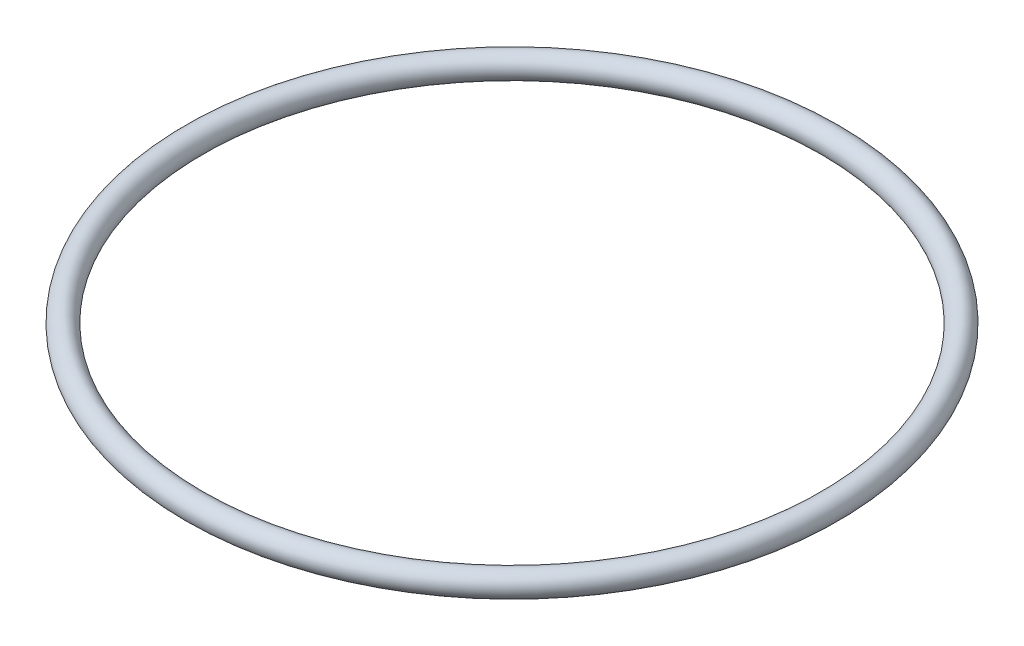
ISO-10303-21;
HEADER;
FILE_DESCRIPTION(('STEP AP214'),'2;1');
FILE_NAME('part.step','',(''),(''),'','','');
FILE_SCHEMA(('AUTOMOTIVE_DESIGN { 1 0 10303 214 1 1 1 1 }'));
ENDSEC;
DATA;
#1=APPLICATION_CONTEXT('core data for automotive mechanical design processes');
#2=APPLICATION_PROTOCOL_DEFINITION('international standard','automotive_design',2000,#1);
#3=PRODUCT_CONTEXT('',#1,'mechanical');
#4=PRODUCT('Part','Part','',(#3));
#5=PRODUCT_RELATED_PRODUCT_CATEGORY('part','',(#4));
#6=PRODUCT_DEFINITION_FORMATION('','',#4);
#7=PRODUCT_DEFINITION_CONTEXT('part definition',#1,'design');
#8=PRODUCT_DEFINITION('design','',#6,#7);
#9=PRODUCT_DEFINITION_SHAPE('','',#8);
#10=(LENGTH_UNIT() NAMED_UNIT(*) SI_UNIT(.MILLI.,.METRE.));
#11=(NAMED_UNIT(*) PLANE_ANGLE_UNIT() SI_UNIT($,.RADIAN.));
#12=(NAMED_UNIT(*) SI_UNIT($,.STERADIAN.) SOLID_ANGLE_UNIT());
#13=UNCERTAINTY_MEASURE_WITH_UNIT(LENGTH_MEASURE(1.E-05),#10,'distance_accuracy_value','');
#14=(GEOMETRIC_REPRESENTATION_CONTEXT(3) GLOBAL_UNCERTAINTY_ASSIGNED_CONTEXT((#13)) GLOBAL_UNIT_ASSIGNED_CONTEXT((#10,
#11,#12)) REPRESENTATION_CONTEXT('',''));
#15=CARTESIAN_POINT('',(0.,0.,0.));
#16=DIRECTION('',(0.,0.,1.));
#17=DIRECTION('',(1.,0.,0.));
#18=AXIS2_PLACEMENT_3D('',#15,#16,#17);
#19=CARTESIAN_POINT('',(0.,0.,0.));
#20=DIRECTION('',(0.,-1.,0.));
#21=DIRECTION('',(0.,0.,-1.));
#22=AXIS2_PLACEMENT_3D('',#19,#20,#21);
#23=TOROIDAL_SURFACE('',#22,33.15,1.25);
#24=CARTESIAN_POINT('',(0.,0.,-34.4));
#25=VERTEX_POINT('',#24);
#26=VERTEX_LOOP('',#25);
#27=FACE_BOUND('',#26,.T.);
#28=ADVANCED_FACE('F28',(#27),#23,.T.);
#29=CLOSED_SHELL('',(#28));
#30=MANIFOLD_SOLID_BREP('B2',#29);
#31=ADVANCED_BREP_SHAPE_REPRESENTATION('',(#18,#30),#14);
#32=SHAPE_DEFINITION_REPRESENTATION(#9,#31);
ENDSEC;
END-ISO-10303-21;
